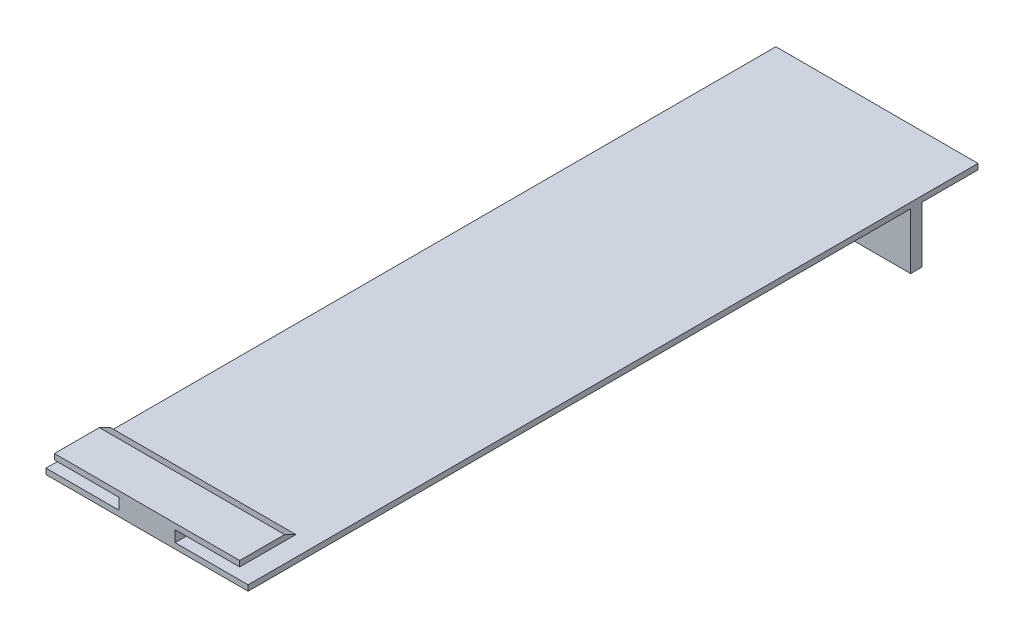
ISO-10303-21;
HEADER;
FILE_DESCRIPTION(('STEP AP214'),'2;1');
FILE_NAME('part.step','',(''),(''),'','','');
FILE_SCHEMA(('AUTOMOTIVE_DESIGN { 1 0 10303 214 1 1 1 1 }'));
ENDSEC;
DATA;
#1=APPLICATION_CONTEXT('core data for automotive mechanical design processes');
#2=APPLICATION_PROTOCOL_DEFINITION('international standard','automotive_design',2000,#1);
#3=PRODUCT_CONTEXT('',#1,'mechanical');
#4=PRODUCT('Part','Part','',(#3));
#5=PRODUCT_RELATED_PRODUCT_CATEGORY('part','',(#4));
#6=PRODUCT_DEFINITION_FORMATION('','',#4);
#7=PRODUCT_DEFINITION_CONTEXT('part definition',#1,'design');
#8=PRODUCT_DEFINITION('design','',#6,#7);
#9=PRODUCT_DEFINITION_SHAPE('','',#8);
#10=(LENGTH_UNIT() NAMED_UNIT(*) SI_UNIT(.MILLI.,.METRE.));
#11=(NAMED_UNIT(*) PLANE_ANGLE_UNIT() SI_UNIT($,.RADIAN.));
#12=(NAMED_UNIT(*) SI_UNIT($,.STERADIAN.) SOLID_ANGLE_UNIT());
#13=UNCERTAINTY_MEASURE_WITH_UNIT(LENGTH_MEASURE(1.E-05),#10,'distance_accuracy_value','');
#14=(GEOMETRIC_REPRESENTATION_CONTEXT(3) GLOBAL_UNCERTAINTY_ASSIGNED_CONTEXT((#13)) GLOBAL_UNIT_ASSIGNED_CONTEXT((#10,
#11,#12)) REPRESENTATION_CONTEXT('',''));
#15=CARTESIAN_POINT('',(0.,0.,0.));
#16=DIRECTION('',(0.,0.,1.));
#17=DIRECTION('',(1.,0.,0.));
#18=AXIS2_PLACEMENT_3D('',#15,#16,#17);
#19=CARTESIAN_POINT('',(-18.,-0.5,65.));
#20=DIRECTION('',(0.,1.,0.));
#21=DIRECTION('',(0.,0.,1.));
#22=AXIS2_PLACEMENT_3D('',#19,#20,#21);
#23=PLANE('',#22);
#24=DIRECTION('',(1.,0.,0.));
#25=VECTOR('',#24,1.);
#26=CARTESIAN_POINT('',(-18.,-0.5,-55.));
#27=LINE('',#26,#25);
#28=CARTESIAN_POINT('',(-18.,-0.5,-55.));
#29=VERTEX_POINT('',#28);
#30=CARTESIAN_POINT('',(18.,-0.5,-55.));
#31=VERTEX_POINT('',#30);
#32=EDGE_CURVE('E50',#29,#31,#27,.T.);
#33=ORIENTED_EDGE('',*,*,#32,.F.);
#34=DIRECTION('',(0.,0.,-1.));
#35=VECTOR('',#34,1.);
#36=CARTESIAN_POINT('',(-18.,-0.5,65.));
#37=LINE('',#36,#35);
#38=CARTESIAN_POINT('',(-18.,-0.5,-65.));
#39=VERTEX_POINT('',#38);
#40=EDGE_CURVE('E210',#29,#39,#37,.T.);
#41=ORIENTED_EDGE('',*,*,#40,.T.);
#42=DIRECTION('',(1.,0.,0.));
#43=VECTOR('',#42,1.);
#44=CARTESIAN_POINT('',(-18.,-0.5,-65.));
#45=LINE('',#44,#43);
#46=CARTESIAN_POINT('',(18.,-0.5,-65.));
#47=VERTEX_POINT('',#46);
#48=EDGE_CURVE('E191',#39,#47,#45,.T.);
#49=ORIENTED_EDGE('',*,*,#48,.T.);
#50=DIRECTION('',(0.,0.,-1.));
#51=VECTOR('',#50,1.);
#52=CARTESIAN_POINT('',(18.,-0.5,65.));
#53=LINE('',#52,#51);
#54=EDGE_CURVE('E55',#31,#47,#53,.T.);
#55=ORIENTED_EDGE('',*,*,#54,.F.);
#56=EDGE_LOOP('',(#33,#41,#49,#55));
#57=FACE_BOUND('',#56,.T.);
#58=ADVANCED_FACE('F35',(#57),#23,.F.);
#59=DIRECTION('',(-1.,0.,0.));
#60=VECTOR('',#59,1.);
#61=CARTESIAN_POINT('',(-18.,-0.5,-53.));
#62=LINE('',#61,#60);
#63=CARTESIAN_POINT('',(18.,-0.5,-53.));
#64=VERTEX_POINT('',#63);
#65=CARTESIAN_POINT('',(-18.,-0.5,-53.));
#66=VERTEX_POINT('',#65);
#67=EDGE_CURVE('E155',#64,#66,#62,.T.);
#68=ORIENTED_EDGE('',*,*,#67,.F.);
#69=CARTESIAN_POINT('',(18.,-0.5,65.));
#70=VERTEX_POINT('',#69);
#71=EDGE_CURVE('E207',#70,#64,#53,.T.);
#72=ORIENTED_EDGE('',*,*,#71,.F.);
#73=DIRECTION('',(1.,0.,0.));
#74=VECTOR('',#73,1.);
#75=CARTESIAN_POINT('',(-18.,-0.5,65.));
#76=LINE('',#75,#74);
#77=CARTESIAN_POINT('',(-18.,-0.5,65.));
#78=VERTEX_POINT('',#77);
#79=EDGE_CURVE('E197',#78,#70,#76,.T.);
#80=ORIENTED_EDGE('',*,*,#79,.F.);
#81=EDGE_CURVE('E211',#78,#66,#37,.T.);
#82=ORIENTED_EDGE('',*,*,#81,.T.);
#83=EDGE_LOOP('',(#68,#72,#80,#82));
#84=FACE_BOUND('',#83,.T.);
#85=ADVANCED_FACE('F322',(#84),#23,.F.);
#86=CARTESIAN_POINT('',(-18.,0.5,65.));
#87=DIRECTION('',(0.,-1.,0.));
#88=DIRECTION('',(0.,0.,-1.));
#89=AXIS2_PLACEMENT_3D('',#86,#87,#88);
#90=PLANE('',#89);
#91=DIRECTION('',(0.,0.,-1.));
#92=VECTOR('',#91,1.);
#93=CARTESIAN_POINT('',(5.,0.5,65.));
#94=LINE('',#93,#92);
#95=CARTESIAN_POINT('',(5.,0.5,65.));
#96=VERTEX_POINT('',#95);
#97=CARTESIAN_POINT('',(5.,0.5,55.));
#98=VERTEX_POINT('',#97);
#99=EDGE_CURVE('E183',#96,#98,#94,.T.);
#100=ORIENTED_EDGE('',*,*,#99,.F.);
#101=DIRECTION('',(-1.,0.,0.));
#102=VECTOR('',#101,1.);
#103=CARTESIAN_POINT('',(-18.,0.5,65.));
#104=LINE('',#103,#102);
#105=CARTESIAN_POINT('',(18.,0.5,65.));
#106=VERTEX_POINT('',#105);
#107=EDGE_CURVE('E192',#106,#96,#104,.T.);
#108=ORIENTED_EDGE('',*,*,#107,.F.);
#109=DIRECTION('',(0.,0.,-1.));
#110=VECTOR('',#109,1.);
#111=CARTESIAN_POINT('',(18.,0.5,65.));
#112=LINE('',#111,#110);
#113=CARTESIAN_POINT('',(18.,0.5,-65.));
#114=VERTEX_POINT('',#113);
#115=EDGE_CURVE('E43',#106,#114,#112,.T.);
#116=ORIENTED_EDGE('',*,*,#115,.T.);
#117=DIRECTION('',(-1.,0.,0.));
#118=VECTOR('',#117,1.);
#119=CARTESIAN_POINT('',(-18.,0.5,-65.));
#120=LINE('',#119,#118);
#121=CARTESIAN_POINT('',(-18.,0.5,-65.));
#122=VERTEX_POINT('',#121);
#123=EDGE_CURVE('E201',#114,#122,#120,.T.);
#124=ORIENTED_EDGE('',*,*,#123,.T.);
#125=DIRECTION('',(0.,0.,-1.));
#126=VECTOR('',#125,1.);
#127=CARTESIAN_POINT('',(-18.,0.5,65.));
#128=LINE('',#127,#126);
#129=CARTESIAN_POINT('',(-18.,0.5,65.));
#130=VERTEX_POINT('',#129);
#131=EDGE_CURVE('E213',#130,#122,#128,.T.);
#132=ORIENTED_EDGE('',*,*,#131,.F.);
#133=CARTESIAN_POINT('',(-5.,0.5,65.));
#134=VERTEX_POINT('',#133);
#135=EDGE_CURVE('E190',#134,#130,#104,.T.);
#136=ORIENTED_EDGE('',*,*,#135,.F.);
#137=DIRECTION('',(0.,0.,-1.));
#138=VECTOR('',#137,1.);
#139=CARTESIAN_POINT('',(-5.,0.5,65.));
#140=LINE('',#139,#138);
#141=CARTESIAN_POINT('',(-5.,0.5,55.));
#142=VERTEX_POINT('',#141);
#143=EDGE_CURVE('E239',#134,#142,#140,.T.);
#144=ORIENTED_EDGE('',*,*,#143,.T.);
#145=DIRECTION('',(1.,0.,0.));
#146=VECTOR('',#145,1.);
#147=CARTESIAN_POINT('',(5.,0.5,55.));
#148=LINE('',#147,#146);
#149=EDGE_CURVE('E265',#142,#98,#148,.T.);
#150=ORIENTED_EDGE('',*,*,#149,.T.);
#151=EDGE_LOOP('',(#100,#108,#116,#124,#132,#136,#144,#150));
#152=FACE_BOUND('',#151,.T.);
#153=ADVANCED_FACE('F219',(#152),#90,.F.);
#154=CARTESIAN_POINT('',(18.,-0.5,65.));
#155=DIRECTION('',(-1.,0.,0.));
#156=DIRECTION('',(0.,0.,1.));
#157=AXIS2_PLACEMENT_3D('',#154,#155,#156);
#158=PLANE('',#157);
#159=DIRECTION('',(0.,1.,0.));
#160=VECTOR('',#159,1.);
#161=CARTESIAN_POINT('',(18.,-0.5,-65.));
#162=LINE('',#161,#160);
#163=EDGE_CURVE('E186',#47,#114,#162,.T.);
#164=ORIENTED_EDGE('',*,*,#163,.T.);
#165=ORIENTED_EDGE('',*,*,#115,.F.);
#166=DIRECTION('',(0.,1.,0.));
#167=VECTOR('',#166,1.);
#168=CARTESIAN_POINT('',(18.,-0.5,65.));
#169=LINE('',#168,#167);
#170=EDGE_CURVE('E187',#70,#106,#169,.T.);
#171=ORIENTED_EDGE('',*,*,#170,.F.);
#172=ORIENTED_EDGE('',*,*,#71,.T.);
#173=DIRECTION('',(0.,1.,0.));
#174=VECTOR('',#173,1.);
#175=CARTESIAN_POINT('',(18.,-10.5,-53.));
#176=LINE('',#175,#174);
#177=CARTESIAN_POINT('',(18.,-10.5,-53.));
#178=VERTEX_POINT('',#177);
#179=EDGE_CURVE('E266',#178,#64,#176,.T.);
#180=ORIENTED_EDGE('',*,*,#179,.F.);
#181=DIRECTION('',(0.,0.,1.));
#182=VECTOR('',#181,1.);
#183=CARTESIAN_POINT('',(18.,-10.5,-55.));
#184=LINE('',#183,#182);
#185=CARTESIAN_POINT('',(18.,-10.5,-55.));
#186=VERTEX_POINT('',#185);
#187=EDGE_CURVE('E288',#186,#178,#184,.T.);
#188=ORIENTED_EDGE('',*,*,#187,.F.);
#189=DIRECTION('',(0.,1.,0.));
#190=VECTOR('',#189,1.);
#191=CARTESIAN_POINT('',(18.,-10.5,-55.));
#192=LINE('',#191,#190);
#193=EDGE_CURVE('E284',#186,#31,#192,.T.);
#194=ORIENTED_EDGE('',*,*,#193,.T.);
#195=ORIENTED_EDGE('',*,*,#54,.T.);
#196=EDGE_LOOP('',(#164,#165,#171,#172,#180,#188,#194,#195));
#197=FACE_BOUND('',#196,.T.);
#198=ADVANCED_FACE('F37',(#197),#158,.F.);
#199=CARTESIAN_POINT('',(-18.,-0.5,65.));
#200=DIRECTION('',(1.,0.,0.));
#201=DIRECTION('',(0.,0.,-1.));
#202=AXIS2_PLACEMENT_3D('',#199,#200,#201);
#203=PLANE('',#202);
#204=DIRECTION('',(0.,-1.,0.));
#205=VECTOR('',#204,1.);
#206=CARTESIAN_POINT('',(-18.,-0.5,-65.));
#207=LINE('',#206,#205);
#208=EDGE_CURVE('E203',#122,#39,#207,.T.);
#209=ORIENTED_EDGE('',*,*,#208,.T.);
#210=ORIENTED_EDGE('',*,*,#40,.F.);
#211=DIRECTION('',(0.,1.,0.));
#212=VECTOR('',#211,1.);
#213=CARTESIAN_POINT('',(-18.,-10.5,-55.));
#214=LINE('',#213,#212);
#215=CARTESIAN_POINT('',(-18.,-10.5,-55.));
#216=VERTEX_POINT('',#215);
#217=EDGE_CURVE('E282',#216,#29,#214,.T.);
#218=ORIENTED_EDGE('',*,*,#217,.F.);
#219=DIRECTION('',(0.,0.,-1.));
#220=VECTOR('',#219,1.);
#221=CARTESIAN_POINT('',(-18.,-10.5,-55.));
#222=LINE('',#221,#220);
#223=CARTESIAN_POINT('',(-18.,-10.5,-53.));
#224=VERTEX_POINT('',#223);
#225=EDGE_CURVE('E292',#224,#216,#222,.T.);
#226=ORIENTED_EDGE('',*,*,#225,.F.);
#227=DIRECTION('',(0.,1.,0.));
#228=VECTOR('',#227,1.);
#229=CARTESIAN_POINT('',(-18.,-10.5,-53.));
#230=LINE('',#229,#228);
#231=EDGE_CURVE('E279',#224,#66,#230,.T.);
#232=ORIENTED_EDGE('',*,*,#231,.T.);
#233=ORIENTED_EDGE('',*,*,#81,.F.);
#234=DIRECTION('',(0.,-1.,0.));
#235=VECTOR('',#234,1.);
#236=CARTESIAN_POINT('',(-18.,-0.5,65.));
#237=LINE('',#236,#235);
#238=EDGE_CURVE('E195',#130,#78,#237,.T.);
#239=ORIENTED_EDGE('',*,*,#238,.F.);
#240=ORIENTED_EDGE('',*,*,#131,.T.);
#241=EDGE_LOOP('',(#209,#210,#218,#226,#232,#233,#239,#240));
#242=FACE_BOUND('',#241,.T.);
#243=ADVANCED_FACE('F230',(#242),#203,.F.);
#244=CARTESIAN_POINT('',(0.,0.,65.));
#245=DIRECTION('',(0.,0.,-1.));
#246=DIRECTION('',(-1.,0.,0.));
#247=AXIS2_PLACEMENT_3D('',#244,#245,#246);
#248=PLANE('',#247);
#249=ORIENTED_EDGE('',*,*,#170,.T.);
#250=ORIENTED_EDGE('',*,*,#107,.T.);
#251=DIRECTION('',(0.,1.,0.));
#252=VECTOR('',#251,1.);
#253=CARTESIAN_POINT('',(5.,2.5,65.));
#254=LINE('',#253,#252);
#255=CARTESIAN_POINT('',(5.,2.5,65.));
#256=VERTEX_POINT('',#255);
#257=EDGE_CURVE('E257',#96,#256,#254,.T.);
#258=ORIENTED_EDGE('',*,*,#257,.T.);
#259=DIRECTION('',(1.,0.,0.));
#260=VECTOR('',#259,1.);
#261=CARTESIAN_POINT('',(16.5,2.5,65.));
#262=LINE('',#261,#260);
#263=CARTESIAN_POINT('',(16.5,2.5,65.));
#264=VERTEX_POINT('',#263);
#265=EDGE_CURVE('E274',#256,#264,#262,.T.);
#266=ORIENTED_EDGE('',*,*,#265,.T.);
#267=DIRECTION('',(0.,1.,0.));
#268=VECTOR('',#267,1.);
#269=CARTESIAN_POINT('',(16.5,3.5,65.));
#270=LINE('',#269,#268);
#271=CARTESIAN_POINT('',(16.5,3.5,65.));
#272=VERTEX_POINT('',#271);
#273=EDGE_CURVE('E272',#264,#272,#270,.T.);
#274=ORIENTED_EDGE('',*,*,#273,.T.);
#275=DIRECTION('',(-1.,0.,0.));
#276=VECTOR('',#275,1.);
#277=CARTESIAN_POINT('',(-16.5,3.5,65.));
#278=LINE('',#277,#276);
#279=CARTESIAN_POINT('',(-16.5,3.5,65.));
#280=VERTEX_POINT('',#279);
#281=EDGE_CURVE('E270',#272,#280,#278,.T.);
#282=ORIENTED_EDGE('',*,*,#281,.T.);
#283=DIRECTION('',(0.,-1.,0.));
#284=VECTOR('',#283,1.);
#285=CARTESIAN_POINT('',(-16.5,2.5,65.));
#286=LINE('',#285,#284);
#287=CARTESIAN_POINT('',(-16.5,2.5,65.));
#288=VERTEX_POINT('',#287);
#289=EDGE_CURVE('E169',#280,#288,#286,.T.);
#290=ORIENTED_EDGE('',*,*,#289,.T.);
#291=DIRECTION('',(1.,0.,0.));
#292=VECTOR('',#291,1.);
#293=CARTESIAN_POINT('',(-5.,2.5,65.));
#294=LINE('',#293,#292);
#295=CARTESIAN_POINT('',(-5.,2.5,65.));
#296=VERTEX_POINT('',#295);
#297=EDGE_CURVE('E245',#288,#296,#294,.T.);
#298=ORIENTED_EDGE('',*,*,#297,.T.);
#299=DIRECTION('',(0.,-1.,0.));
#300=VECTOR('',#299,1.);
#301=CARTESIAN_POINT('',(-5.,0.5,65.));
#302=LINE('',#301,#300);
#303=EDGE_CURVE('E243',#296,#134,#302,.T.);
#304=ORIENTED_EDGE('',*,*,#303,.T.);
#305=ORIENTED_EDGE('',*,*,#135,.T.);
#306=ORIENTED_EDGE('',*,*,#238,.T.);
#307=ORIENTED_EDGE('',*,*,#79,.T.);
#308=EDGE_LOOP('',(#249,#250,#258,#266,#274,#282,#290,#298,#304,#305,#306,#307));
#309=FACE_BOUND('',#308,.T.);
#310=ADVANCED_FACE('F241',(#309),#248,.F.);
#311=CARTESIAN_POINT('',(0.,0.,-65.));
#312=DIRECTION('',(0.,0.,-1.));
#313=DIRECTION('',(-1.,0.,0.));
#314=AXIS2_PLACEMENT_3D('',#311,#312,#313);
#315=PLANE('',#314);
#316=ORIENTED_EDGE('',*,*,#163,.F.);
#317=ORIENTED_EDGE('',*,*,#48,.F.);
#318=ORIENTED_EDGE('',*,*,#208,.F.);
#319=ORIENTED_EDGE('',*,*,#123,.F.);
#320=EDGE_LOOP('',(#316,#317,#318,#319));
#321=FACE_BOUND('',#320,.T.);
#322=ADVANCED_FACE('F227',(#321),#315,.T.);
#323=CARTESIAN_POINT('',(5.,2.5,65.));
#324=DIRECTION('',(-1.,0.,0.));
#325=DIRECTION('',(0.,-1.,0.));
#326=AXIS2_PLACEMENT_3D('',#323,#324,#325);
#327=PLANE('',#326);
#328=DIRECTION('',(0.,1.,0.));
#329=VECTOR('',#328,1.);
#330=CARTESIAN_POINT('',(5.,2.5,55.));
#331=LINE('',#330,#329);
#332=CARTESIAN_POINT('',(5.,2.5,55.));
#333=VERTEX_POINT('',#332);
#334=EDGE_CURVE('E262',#98,#333,#331,.T.);
#335=ORIENTED_EDGE('',*,*,#334,.T.);
#336=DIRECTION('',(0.,0.,-1.));
#337=VECTOR('',#336,1.);
#338=CARTESIAN_POINT('',(5.,2.5,65.));
#339=LINE('',#338,#337);
#340=EDGE_CURVE('E180',#256,#333,#339,.T.);
#341=ORIENTED_EDGE('',*,*,#340,.F.);
#342=ORIENTED_EDGE('',*,*,#257,.F.);
#343=ORIENTED_EDGE('',*,*,#99,.T.);
#344=EDGE_LOOP('',(#335,#341,#342,#343));
#345=FACE_BOUND('',#344,.T.);
#346=ADVANCED_FACE('F308',(#345),#327,.F.);
#347=CARTESIAN_POINT('',(16.5,2.5,65.));
#348=DIRECTION('',(0.,1.,0.));
#349=DIRECTION('',(0.,0.,1.));
#350=AXIS2_PLACEMENT_3D('',#347,#348,#349);
#351=PLANE('',#350);
#352=DIRECTION('',(1.,0.,0.));
#353=VECTOR('',#352,1.);
#354=CARTESIAN_POINT('',(16.5,2.5,55.));
#355=LINE('',#354,#353);
#356=CARTESIAN_POINT('',(16.5,2.5,55.));
#357=VERTEX_POINT('',#356);
#358=EDGE_CURVE('E259',#333,#357,#355,.T.);
#359=ORIENTED_EDGE('',*,*,#358,.T.);
#360=DIRECTION('',(0.,0.,-1.));
#361=VECTOR('',#360,1.);
#362=CARTESIAN_POINT('',(16.5,2.5,65.));
#363=LINE('',#362,#361);
#364=EDGE_CURVE('E172',#264,#357,#363,.T.);
#365=ORIENTED_EDGE('',*,*,#364,.F.);
#366=ORIENTED_EDGE('',*,*,#265,.F.);
#367=ORIENTED_EDGE('',*,*,#340,.T.);
#368=EDGE_LOOP('',(#359,#365,#366,#367));
#369=FACE_BOUND('',#368,.T.);
#370=ADVANCED_FACE('F302',(#369),#351,.F.);
#371=CARTESIAN_POINT('',(16.5,3.5,65.));
#372=DIRECTION('',(-1.,0.,0.));
#373=DIRECTION('',(0.,0.,1.));
#374=AXIS2_PLACEMENT_3D('',#371,#372,#373);
#375=PLANE('',#374);
#376=ORIENTED_EDGE('',*,*,#364,.T.);
#377=DIRECTION('',(0.,-0.447213595499958,-0.894427190999916));
#378=VECTOR('',#377,1.);
#379=CARTESIAN_POINT('',(16.5,3.5,57.));
#380=LINE('',#379,#378);
#381=CARTESIAN_POINT('',(16.5,3.5,57.));
#382=VERTEX_POINT('',#381);
#383=EDGE_CURVE('E166',#382,#357,#380,.T.);
#384=ORIENTED_EDGE('',*,*,#383,.F.);
#385=DIRECTION('',(0.,0.,-1.));
#386=VECTOR('',#385,1.);
#387=CARTESIAN_POINT('',(16.5,3.5,65.));
#388=LINE('',#387,#386);
#389=EDGE_CURVE('E165',#272,#382,#388,.T.);
#390=ORIENTED_EDGE('',*,*,#389,.F.);
#391=ORIENTED_EDGE('',*,*,#273,.F.);
#392=EDGE_LOOP('',(#376,#384,#390,#391));
#393=FACE_BOUND('',#392,.T.);
#394=ADVANCED_FACE('F306',(#393),#375,.F.);
#395=CARTESIAN_POINT('',(-16.5,3.5,65.));
#396=DIRECTION('',(0.,-1.,0.));
#397=DIRECTION('',(0.,0.,-1.));
#398=AXIS2_PLACEMENT_3D('',#395,#396,#397);
#399=PLANE('',#398);
#400=ORIENTED_EDGE('',*,*,#389,.T.);
#401=DIRECTION('',(1.,0.,0.));
#402=VECTOR('',#401,1.);
#403=CARTESIAN_POINT('',(-18.001,3.5,57.));
#404=LINE('',#403,#402);
#405=CARTESIAN_POINT('',(-16.5,3.5,57.));
#406=VERTEX_POINT('',#405);
#407=EDGE_CURVE('E147',#406,#382,#404,.T.);
#408=ORIENTED_EDGE('',*,*,#407,.F.);
#409=DIRECTION('',(0.,0.,-1.));
#410=VECTOR('',#409,1.);
#411=CARTESIAN_POINT('',(-16.5,3.5,65.));
#412=LINE('',#411,#410);
#413=EDGE_CURVE('E162',#280,#406,#412,.T.);
#414=ORIENTED_EDGE('',*,*,#413,.F.);
#415=ORIENTED_EDGE('',*,*,#281,.F.);
#416=EDGE_LOOP('',(#400,#408,#414,#415));
#417=FACE_BOUND('',#416,.T.);
#418=ADVANCED_FACE('F160',(#417),#399,.F.);
#419=CARTESIAN_POINT('',(-16.5,2.5,65.));
#420=DIRECTION('',(1.,0.,0.));
#421=DIRECTION('',(0.,0.,-1.));
#422=AXIS2_PLACEMENT_3D('',#419,#420,#421);
#423=PLANE('',#422);
#424=ORIENTED_EDGE('',*,*,#413,.T.);
#425=DIRECTION('',(0.,0.447213595499958,0.894427190999916));
#426=VECTOR('',#425,1.);
#427=CARTESIAN_POINT('',(-16.5,3.5,57.));
#428=LINE('',#427,#426);
#429=CARTESIAN_POINT('',(-16.5,2.5,55.));
#430=VERTEX_POINT('',#429);
#431=EDGE_CURVE('E144',#430,#406,#428,.T.);
#432=ORIENTED_EDGE('',*,*,#431,.F.);
#433=DIRECTION('',(0.,0.,-1.));
#434=VECTOR('',#433,1.);
#435=CARTESIAN_POINT('',(-16.5,2.5,65.));
#436=LINE('',#435,#434);
#437=EDGE_CURVE('E170',#288,#430,#436,.T.);
#438=ORIENTED_EDGE('',*,*,#437,.F.);
#439=ORIENTED_EDGE('',*,*,#289,.F.);
#440=EDGE_LOOP('',(#424,#432,#438,#439));
#441=FACE_BOUND('',#440,.T.);
#442=ADVANCED_FACE('F168',(#441),#423,.F.);
#443=CARTESIAN_POINT('',(-5.,2.5,65.));
#444=DIRECTION('',(0.,1.,0.));
#445=DIRECTION('',(0.,0.,1.));
#446=AXIS2_PLACEMENT_3D('',#443,#444,#445);
#447=PLANE('',#446);
#448=DIRECTION('',(1.,0.,0.));
#449=VECTOR('',#448,1.);
#450=CARTESIAN_POINT('',(-5.,2.5,55.));
#451=LINE('',#450,#449);
#452=CARTESIAN_POINT('',(-5.,2.5,55.));
#453=VERTEX_POINT('',#452);
#454=EDGE_CURVE('E150',#430,#453,#451,.T.);
#455=ORIENTED_EDGE('',*,*,#454,.T.);
#456=DIRECTION('',(0.,0.,-1.));
#457=VECTOR('',#456,1.);
#458=CARTESIAN_POINT('',(-5.,2.5,65.));
#459=LINE('',#458,#457);
#460=EDGE_CURVE('E174',#296,#453,#459,.T.);
#461=ORIENTED_EDGE('',*,*,#460,.F.);
#462=ORIENTED_EDGE('',*,*,#297,.F.);
#463=ORIENTED_EDGE('',*,*,#437,.T.);
#464=EDGE_LOOP('',(#455,#461,#462,#463));
#465=FACE_BOUND('',#464,.T.);
#466=ADVANCED_FACE('F312',(#465),#447,.F.);
#467=CARTESIAN_POINT('',(-5.,0.5,65.));
#468=DIRECTION('',(1.,0.,0.));
#469=DIRECTION('',(0.,1.,0.));
#470=AXIS2_PLACEMENT_3D('',#467,#468,#469);
#471=PLANE('',#470);
#472=DIRECTION('',(0.,-1.,0.));
#473=VECTOR('',#472,1.);
#474=CARTESIAN_POINT('',(-5.,0.5,55.));
#475=LINE('',#474,#473);
#476=EDGE_CURVE('E253',#453,#142,#475,.T.);
#477=ORIENTED_EDGE('',*,*,#476,.T.);
#478=ORIENTED_EDGE('',*,*,#143,.F.);
#479=ORIENTED_EDGE('',*,*,#303,.F.);
#480=ORIENTED_EDGE('',*,*,#460,.T.);
#481=EDGE_LOOP('',(#477,#478,#479,#480));
#482=FACE_BOUND('',#481,.T.);
#483=ADVANCED_FACE('F251',(#482),#471,.F.);
#484=CARTESIAN_POINT('',(0.,0.,55.));
#485=DIRECTION('',(0.,0.,-1.));
#486=DIRECTION('',(-1.,0.,0.));
#487=AXIS2_PLACEMENT_3D('',#484,#485,#486);
#488=PLANE('',#487);
#489=DIRECTION('',(-1.,0.,0.));
#490=VECTOR('',#489,1.);
#491=CARTESIAN_POINT('',(0.,2.5,55.));
#492=LINE('',#491,#490);
#493=EDGE_CURVE('E11',#333,#453,#492,.T.);
#494=ORIENTED_EDGE('',*,*,#493,.F.);
#495=ORIENTED_EDGE('',*,*,#334,.F.);
#496=ORIENTED_EDGE('',*,*,#149,.F.);
#497=ORIENTED_EDGE('',*,*,#476,.F.);
#498=EDGE_LOOP('',(#494,#495,#496,#497));
#499=FACE_BOUND('',#498,.T.);
#500=ADVANCED_FACE('F310',(#499),#488,.T.);
#501=CARTESIAN_POINT('',(-18.,-10.5,-53.));
#502=DIRECTION('',(0.,0.,-1.));
#503=DIRECTION('',(-1.,0.,0.));
#504=AXIS2_PLACEMENT_3D('',#501,#502,#503);
#505=PLANE('',#504);
#506=ORIENTED_EDGE('',*,*,#67,.T.);
#507=ORIENTED_EDGE('',*,*,#231,.F.);
#508=DIRECTION('',(-1.,0.,0.));
#509=VECTOR('',#508,1.);
#510=CARTESIAN_POINT('',(-18.,-10.5,-53.));
#511=LINE('',#510,#509);
#512=EDGE_CURVE('E294',#178,#224,#511,.T.);
#513=ORIENTED_EDGE('',*,*,#512,.F.);
#514=ORIENTED_EDGE('',*,*,#179,.T.);
#515=EDGE_LOOP('',(#506,#507,#513,#514));
#516=FACE_BOUND('',#515,.T.);
#517=ADVANCED_FACE('F402',(#516),#505,.F.);
#518=CARTESIAN_POINT('',(-18.,-10.5,-55.));
#519=DIRECTION('',(0.,0.,1.));
#520=DIRECTION('',(1.,0.,0.));
#521=AXIS2_PLACEMENT_3D('',#518,#519,#520);
#522=PLANE('',#521);
#523=ORIENTED_EDGE('',*,*,#32,.T.);
#524=ORIENTED_EDGE('',*,*,#193,.F.);
#525=DIRECTION('',(1.,0.,0.));
#526=VECTOR('',#525,1.);
#527=CARTESIAN_POINT('',(-18.,-10.5,-55.));
#528=LINE('',#527,#526);
#529=EDGE_CURVE('E286',#216,#186,#528,.T.);
#530=ORIENTED_EDGE('',*,*,#529,.F.);
#531=ORIENTED_EDGE('',*,*,#217,.T.);
#532=EDGE_LOOP('',(#523,#524,#530,#531));
#533=FACE_BOUND('',#532,.T.);
#534=ADVANCED_FACE('F421',(#533),#522,.F.);
#535=CARTESIAN_POINT('',(0.,-10.5,0.));
#536=DIRECTION('',(0.,1.,0.));
#537=DIRECTION('',(0.,0.,1.));
#538=AXIS2_PLACEMENT_3D('',#535,#536,#537);
#539=PLANE('',#538);
#540=ORIENTED_EDGE('',*,*,#187,.T.);
#541=ORIENTED_EDGE('',*,*,#512,.T.);
#542=ORIENTED_EDGE('',*,*,#225,.T.);
#543=ORIENTED_EDGE('',*,*,#529,.T.);
#544=EDGE_LOOP('',(#540,#541,#542,#543));
#545=FACE_BOUND('',#544,.T.);
#546=ADVANCED_FACE('F412',(#545),#539,.F.);
#547=CARTESIAN_POINT('',(-18.001,3.5,57.));
#548=DIRECTION('',(0.,-0.894427190999916,0.447213595499958));
#549=DIRECTION('',(0.,-0.447213595499958,-0.894427190999916));
#550=AXIS2_PLACEMENT_3D('',#547,#548,#549);
#551=PLANE('',#550);
#552=ORIENTED_EDGE('',*,*,#431,.T.);
#553=ORIENTED_EDGE('',*,*,#407,.T.);
#554=ORIENTED_EDGE('',*,*,#383,.T.);
#555=ORIENTED_EDGE('',*,*,#358,.F.);
#556=ORIENTED_EDGE('',*,*,#493,.T.);
#557=ORIENTED_EDGE('',*,*,#454,.F.);
#558=EDGE_LOOP('',(#552,#553,#554,#555,#556,#557));
#559=FACE_BOUND('',#558,.T.);
#560=ADVANCED_FACE('F146',(#559),#551,.F.);
#561=CLOSED_SHELL('',(#58,#85,#153,#198,#243,#310,#322,#346,#370,#394,#418,#442,#466,#483,#500,
#517,#534,#546,#560));
#562=MANIFOLD_SOLID_BREP('B2',#561);
#563=ADVANCED_BREP_SHAPE_REPRESENTATION('',(#18,#562),#14);
#564=SHAPE_DEFINITION_REPRESENTATION(#9,#563);
ENDSEC;
END-ISO-10303-21;
